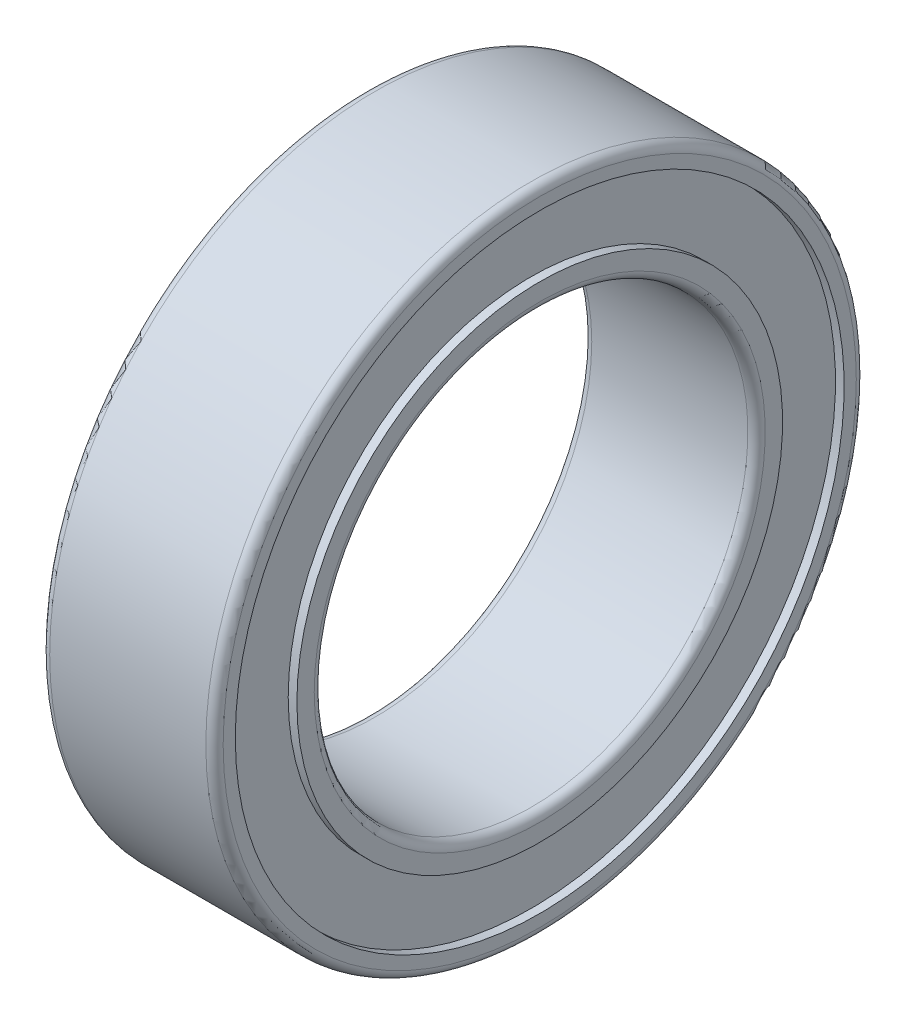
ISO-10303-21;
HEADER;
FILE_DESCRIPTION(('STEP AP214'),'2;1');
FILE_NAME('part.step','',(''),(''),'','','');
FILE_SCHEMA(('AUTOMOTIVE_DESIGN { 1 0 10303 214 1 1 1 1 }'));
ENDSEC;
DATA;
#1=APPLICATION_CONTEXT('core data for automotive mechanical design processes');
#2=APPLICATION_PROTOCOL_DEFINITION('international standard','automotive_design',2000,#1);
#3=PRODUCT_CONTEXT('',#1,'mechanical');
#4=PRODUCT('Part','Part','',(#3));
#5=PRODUCT_RELATED_PRODUCT_CATEGORY('part','',(#4));
#6=PRODUCT_DEFINITION_FORMATION('','',#4);
#7=PRODUCT_DEFINITION_CONTEXT('part definition',#1,'design');
#8=PRODUCT_DEFINITION('design','',#6,#7);
#9=PRODUCT_DEFINITION_SHAPE('','',#8);
#10=(LENGTH_UNIT() NAMED_UNIT(*) SI_UNIT(.MILLI.,.METRE.));
#11=(NAMED_UNIT(*) PLANE_ANGLE_UNIT() SI_UNIT($,.RADIAN.));
#12=(NAMED_UNIT(*) SI_UNIT($,.STERADIAN.) SOLID_ANGLE_UNIT());
#13=UNCERTAINTY_MEASURE_WITH_UNIT(LENGTH_MEASURE(1.E-05),#10,'distance_accuracy_value','');
#14=(GEOMETRIC_REPRESENTATION_CONTEXT(3) GLOBAL_UNCERTAINTY_ASSIGNED_CONTEXT((#13)) GLOBAL_UNIT_ASSIGNED_CONTEXT((#10,
#11,#12)) REPRESENTATION_CONTEXT('',''));
#15=CARTESIAN_POINT('',(0.,0.,0.));
#16=DIRECTION('',(0.,0.,1.));
#17=DIRECTION('',(1.,0.,0.));
#18=AXIS2_PLACEMENT_3D('',#15,#16,#17);
#19=CARTESIAN_POINT('',(0.,7.5,0.));
#20=DIRECTION('',(1.,0.,0.));
#21=DIRECTION('',(0.,0.,-1.));
#22=AXIS2_PLACEMENT_3D('',#19,#20,#21);
#23=PLANE('',#22);
#24=CARTESIAN_POINT('',(0.,0.,0.));
#25=DIRECTION('',(1.,0.,0.));
#26=DIRECTION('',(0.,0.,-1.));
#27=AXIS2_PLACEMENT_3D('',#24,#25,#26);
#28=CIRCLE('',#27,7.3);
#29=CARTESIAN_POINT('',(0.,0.,-7.3));
#30=VERTEX_POINT('',#29);
#31=EDGE_CURVE('E66',#30,#30,#28,.F.);
#32=ORIENTED_EDGE('',*,*,#31,.T.);
#33=EDGE_LOOP('',(#32));
#34=FACE_BOUND('',#33,.T.);
#35=CARTESIAN_POINT('',(0.,0.,0.));
#36=DIRECTION('',(-1.,0.,0.));
#37=DIRECTION('',(0.,0.,1.));
#38=AXIS2_PLACEMENT_3D('',#35,#36,#37);
#39=CIRCLE('',#38,7.02);
#40=CARTESIAN_POINT('',(0.,0.,7.02));
#41=VERTEX_POINT('',#40);
#42=EDGE_CURVE('E82',#41,#41,#39,.T.);
#43=ORIENTED_EDGE('',*,*,#42,.F.);
#44=EDGE_LOOP('',(#43));
#45=FACE_BOUND('',#44,.T.);
#46=ADVANCED_FACE('F40',(#34,#45),#23,.F.);
#47=CARTESIAN_POINT('',(0.,0.,0.));
#48=DIRECTION('',(-1.,0.,0.));
#49=DIRECTION('',(0.,0.,1.));
#50=AXIS2_PLACEMENT_3D('',#47,#48,#49);
#51=CYLINDRICAL_SURFACE('',#50,7.02);
#52=CARTESIAN_POINT('',(0.2,0.,0.));
#53=DIRECTION('',(-1.,0.,0.));
#54=DIRECTION('',(0.,0.,1.));
#55=AXIS2_PLACEMENT_3D('',#52,#53,#54);
#56=CIRCLE('',#55,7.02);
#57=CARTESIAN_POINT('',(0.2,0.,7.02));
#58=VERTEX_POINT('',#57);
#59=EDGE_CURVE('E86',#58,#58,#56,.T.);
#60=ORIENTED_EDGE('',*,*,#59,.F.);
#61=EDGE_LOOP('',(#60));
#62=FACE_BOUND('',#61,.T.);
#63=ORIENTED_EDGE('',*,*,#42,.T.);
#64=EDGE_LOOP('',(#63));
#65=FACE_BOUND('',#64,.T.);
#66=ADVANCED_FACE('F147',(#62,#65),#51,.F.);
#67=CARTESIAN_POINT('',(0.2,7.02,0.));
#68=DIRECTION('',(1.,0.,0.));
#69=DIRECTION('',(0.,0.,-1.));
#70=AXIS2_PLACEMENT_3D('',#67,#68,#69);
#71=PLANE('',#70);
#72=CARTESIAN_POINT('',(0.2,0.,0.));
#73=DIRECTION('',(-1.,0.,0.));
#74=DIRECTION('',(0.,0.,1.));
#75=AXIS2_PLACEMENT_3D('',#72,#73,#74);
#76=CIRCLE('',#75,5.6);
#77=CARTESIAN_POINT('',(0.2,0.,5.6));
#78=VERTEX_POINT('',#77);
#79=EDGE_CURVE('E90',#78,#78,#76,.T.);
#80=ORIENTED_EDGE('',*,*,#79,.F.);
#81=EDGE_LOOP('',(#80));
#82=FACE_BOUND('',#81,.T.);
#83=ORIENTED_EDGE('',*,*,#59,.T.);
#84=EDGE_LOOP('',(#83));
#85=FACE_BOUND('',#84,.T.);
#86=ADVANCED_FACE('F153',(#82,#85),#71,.F.);
#87=CARTESIAN_POINT('',(0.,0.,0.));
#88=DIRECTION('',(-1.,0.,0.));
#89=DIRECTION('',(0.,0.,1.));
#90=AXIS2_PLACEMENT_3D('',#87,#88,#89);
#91=CYLINDRICAL_SURFACE('',#90,5.6);
#92=CARTESIAN_POINT('',(0.,0.,0.));
#93=DIRECTION('',(-1.,0.,0.));
#94=DIRECTION('',(0.,0.,1.));
#95=AXIS2_PLACEMENT_3D('',#92,#93,#94);
#96=CIRCLE('',#95,5.6);
#97=CARTESIAN_POINT('',(0.,0.,5.6));
#98=VERTEX_POINT('',#97);
#99=EDGE_CURVE('E94',#98,#98,#96,.T.);
#100=ORIENTED_EDGE('',*,*,#99,.F.);
#101=EDGE_LOOP('',(#100));
#102=FACE_BOUND('',#101,.T.);
#103=ORIENTED_EDGE('',*,*,#79,.T.);
#104=EDGE_LOOP('',(#103));
#105=FACE_BOUND('',#104,.T.);
#106=ADVANCED_FACE('F254',(#102,#105),#91,.T.);
#107=CARTESIAN_POINT('',(0.,5.6,0.));
#108=DIRECTION('',(1.,0.,0.));
#109=DIRECTION('',(0.,0.,-1.));
#110=AXIS2_PLACEMENT_3D('',#107,#108,#109);
#111=PLANE('',#110);
#112=CARTESIAN_POINT('',(0.,0.,0.));
#113=DIRECTION('',(1.,0.,0.));
#114=DIRECTION('',(0.,0.,-1.));
#115=AXIS2_PLACEMENT_3D('',#112,#113,#114);
#116=CIRCLE('',#115,5.2);
#117=CARTESIAN_POINT('',(0.,0.,-5.2));
#118=VERTEX_POINT('',#117);
#119=EDGE_CURVE('E10',#118,#118,#116,.T.);
#120=ORIENTED_EDGE('',*,*,#119,.T.);
#121=EDGE_LOOP('',(#120));
#122=FACE_BOUND('',#121,.T.);
#123=ORIENTED_EDGE('',*,*,#99,.T.);
#124=EDGE_LOOP('',(#123));
#125=FACE_BOUND('',#124,.T.);
#126=ADVANCED_FACE('F144',(#122,#125),#111,.F.);
#127=CARTESIAN_POINT('',(0.,0.,0.));
#128=DIRECTION('',(-1.,0.,0.));
#129=DIRECTION('',(0.,0.,1.));
#130=AXIS2_PLACEMENT_3D('',#127,#128,#129);
#131=CYLINDRICAL_SURFACE('',#130,5.);
#132=CARTESIAN_POINT('',(3.80000000000001,0.,0.));
#133=DIRECTION('',(-1.,0.,0.));
#134=DIRECTION('',(0.,0.,1.));
#135=AXIS2_PLACEMENT_3D('',#132,#133,#134);
#136=CIRCLE('',#135,5.);
#137=CARTESIAN_POINT('',(3.80000000000001,0.,5.));
#138=VERTEX_POINT('',#137);
#139=EDGE_CURVE('E48',#138,#138,#136,.F.);
#140=ORIENTED_EDGE('',*,*,#139,.T.);
#141=EDGE_LOOP('',(#140));
#142=FACE_BOUND('',#141,.T.);
#143=CARTESIAN_POINT('',(0.200000000000006,0.,0.));
#144=DIRECTION('',(1.,0.,0.));
#145=DIRECTION('',(0.,0.,-1.));
#146=AXIS2_PLACEMENT_3D('',#143,#144,#145);
#147=CIRCLE('',#146,5.);
#148=CARTESIAN_POINT('',(0.200000000000006,0.,-5.));
#149=VERTEX_POINT('',#148);
#150=EDGE_CURVE('E54',#149,#149,#147,.F.);
#151=ORIENTED_EDGE('',*,*,#150,.T.);
#152=EDGE_LOOP('',(#151));
#153=FACE_BOUND('',#152,.T.);
#154=ADVANCED_FACE('F138',(#142,#153),#131,.F.);
#155=CARTESIAN_POINT('',(4.00000000000001,5.60000000000001,0.));
#156=DIRECTION('',(-1.,0.,0.));
#157=DIRECTION('',(0.,0.,1.));
#158=AXIS2_PLACEMENT_3D('',#155,#156,#157);
#159=PLANE('',#158);
#160=CARTESIAN_POINT('',(4.00000000000001,0.,0.));
#161=DIRECTION('',(-1.,0.,0.));
#162=DIRECTION('',(0.,0.,1.));
#163=AXIS2_PLACEMENT_3D('',#160,#161,#162);
#164=CIRCLE('',#163,5.2);
#165=CARTESIAN_POINT('',(4.00000000000001,0.,5.2));
#166=VERTEX_POINT('',#165);
#167=EDGE_CURVE('E60',#166,#166,#164,.T.);
#168=ORIENTED_EDGE('',*,*,#167,.T.);
#169=EDGE_LOOP('',(#168));
#170=FACE_BOUND('',#169,.T.);
#171=CARTESIAN_POINT('',(4.00000000000001,0.,0.));
#172=DIRECTION('',(-1.,0.,0.));
#173=DIRECTION('',(0.,0.,1.));
#174=AXIS2_PLACEMENT_3D('',#171,#172,#173);
#175=CIRCLE('',#174,5.60000000000001);
#176=CARTESIAN_POINT('',(4.00000000000001,0.,5.60000000000001));
#177=VERTEX_POINT('',#176);
#178=EDGE_CURVE('E98',#177,#177,#175,.T.);
#179=ORIENTED_EDGE('',*,*,#178,.F.);
#180=EDGE_LOOP('',(#179));
#181=FACE_BOUND('',#180,.T.);
#182=ADVANCED_FACE('F133',(#170,#181),#159,.F.);
#183=CARTESIAN_POINT('',(0.,0.,0.));
#184=DIRECTION('',(-1.,0.,0.));
#185=DIRECTION('',(0.,0.,1.));
#186=AXIS2_PLACEMENT_3D('',#183,#184,#185);
#187=CYLINDRICAL_SURFACE('',#186,5.6);
#188=CARTESIAN_POINT('',(3.8,0.,0.));
#189=DIRECTION('',(-1.,0.,0.));
#190=DIRECTION('',(0.,0.,1.));
#191=AXIS2_PLACEMENT_3D('',#188,#189,#190);
#192=CIRCLE('',#191,5.6);
#193=CARTESIAN_POINT('',(3.8,0.,5.6));
#194=VERTEX_POINT('',#193);
#195=EDGE_CURVE('E102',#194,#194,#192,.T.);
#196=ORIENTED_EDGE('',*,*,#195,.F.);
#197=EDGE_LOOP('',(#196));
#198=FACE_BOUND('',#197,.T.);
#199=ORIENTED_EDGE('',*,*,#178,.T.);
#200=EDGE_LOOP('',(#199));
#201=FACE_BOUND('',#200,.T.);
#202=ADVANCED_FACE('F127',(#198,#201),#187,.T.);
#203=CARTESIAN_POINT('',(3.8,7.02,0.));
#204=DIRECTION('',(-1.,0.,0.));
#205=DIRECTION('',(0.,0.,1.));
#206=AXIS2_PLACEMENT_3D('',#203,#204,#205);
#207=PLANE('',#206);
#208=CARTESIAN_POINT('',(3.8,0.,0.));
#209=DIRECTION('',(-1.,0.,0.));
#210=DIRECTION('',(0.,0.,1.));
#211=AXIS2_PLACEMENT_3D('',#208,#209,#210);
#212=CIRCLE('',#211,7.02);
#213=CARTESIAN_POINT('',(3.8,0.,7.02));
#214=VERTEX_POINT('',#213);
#215=EDGE_CURVE('E106',#214,#214,#212,.T.);
#216=ORIENTED_EDGE('',*,*,#215,.F.);
#217=EDGE_LOOP('',(#216));
#218=FACE_BOUND('',#217,.T.);
#219=ORIENTED_EDGE('',*,*,#195,.T.);
#220=EDGE_LOOP('',(#219));
#221=FACE_BOUND('',#220,.T.);
#222=ADVANCED_FACE('F121',(#218,#221),#207,.F.);
#223=CARTESIAN_POINT('',(0.,0.,0.));
#224=DIRECTION('',(-1.,0.,0.));
#225=DIRECTION('',(0.,0.,1.));
#226=AXIS2_PLACEMENT_3D('',#223,#224,#225);
#227=CYLINDRICAL_SURFACE('',#226,7.02);
#228=CARTESIAN_POINT('',(4.00000000000001,0.,0.));
#229=DIRECTION('',(-1.,0.,0.));
#230=DIRECTION('',(0.,0.,1.));
#231=AXIS2_PLACEMENT_3D('',#228,#229,#230);
#232=CIRCLE('',#231,7.02);
#233=CARTESIAN_POINT('',(4.00000000000001,0.,7.02));
#234=VERTEX_POINT('',#233);
#235=EDGE_CURVE('E110',#234,#234,#232,.T.);
#236=ORIENTED_EDGE('',*,*,#235,.F.);
#237=EDGE_LOOP('',(#236));
#238=FACE_BOUND('',#237,.T.);
#239=ORIENTED_EDGE('',*,*,#215,.T.);
#240=EDGE_LOOP('',(#239));
#241=FACE_BOUND('',#240,.T.);
#242=ADVANCED_FACE('F118',(#238,#241),#227,.F.);
#243=CARTESIAN_POINT('',(4.00000000000001,7.50000000000001,0.));
#244=DIRECTION('',(-1.,0.,0.));
#245=DIRECTION('',(0.,0.,1.));
#246=AXIS2_PLACEMENT_3D('',#243,#244,#245);
#247=PLANE('',#246);
#248=CARTESIAN_POINT('',(4.00000000000001,0.,0.));
#249=DIRECTION('',(-1.,0.,0.));
#250=DIRECTION('',(0.,0.,1.));
#251=AXIS2_PLACEMENT_3D('',#248,#249,#250);
#252=CIRCLE('',#251,7.3);
#253=CARTESIAN_POINT('',(4.00000000000001,0.,7.3));
#254=VERTEX_POINT('',#253);
#255=EDGE_CURVE('E70',#254,#254,#252,.F.);
#256=ORIENTED_EDGE('',*,*,#255,.T.);
#257=EDGE_LOOP('',(#256));
#258=FACE_BOUND('',#257,.T.);
#259=ORIENTED_EDGE('',*,*,#235,.T.);
#260=EDGE_LOOP('',(#259));
#261=FACE_BOUND('',#260,.T.);
#262=ADVANCED_FACE('F116',(#258,#261),#247,.F.);
#263=CARTESIAN_POINT('',(0.,0.,0.));
#264=DIRECTION('',(-1.,0.,0.));
#265=DIRECTION('',(0.,0.,1.));
#266=AXIS2_PLACEMENT_3D('',#263,#264,#265);
#267=CYLINDRICAL_SURFACE('',#266,7.5);
#268=CARTESIAN_POINT('',(3.80000000000001,0.,0.));
#269=DIRECTION('',(-1.,0.,0.));
#270=DIRECTION('',(0.,0.,1.));
#271=AXIS2_PLACEMENT_3D('',#268,#269,#270);
#272=CIRCLE('',#271,7.5);
#273=CARTESIAN_POINT('',(3.80000000000001,0.,7.5));
#274=VERTEX_POINT('',#273);
#275=EDGE_CURVE('E74',#274,#274,#272,.T.);
#276=ORIENTED_EDGE('',*,*,#275,.T.);
#277=EDGE_LOOP('',(#276));
#278=FACE_BOUND('',#277,.T.);
#279=CARTESIAN_POINT('',(0.200000000000006,0.,0.));
#280=DIRECTION('',(1.,0.,0.));
#281=DIRECTION('',(0.,0.,-1.));
#282=AXIS2_PLACEMENT_3D('',#279,#280,#281);
#283=CIRCLE('',#282,7.5);
#284=CARTESIAN_POINT('',(0.200000000000006,0.,-7.5));
#285=VERTEX_POINT('',#284);
#286=EDGE_CURVE('E78',#285,#285,#283,.T.);
#287=ORIENTED_EDGE('',*,*,#286,.T.);
#288=EDGE_LOOP('',(#287));
#289=FACE_BOUND('',#288,.T.);
#290=ADVANCED_FACE('F163',(#278,#289),#267,.T.);
#291=CARTESIAN_POINT('',(3.80000000000001,0.,0.));
#292=DIRECTION('',(-1.,0.,0.));
#293=DIRECTION('',(0.,0.,1.));
#294=AXIS2_PLACEMENT_3D('',#291,#292,#293);
#295=TOROIDAL_SURFACE('',#294,7.3,0.2);
#296=ORIENTED_EDGE('',*,*,#255,.F.);
#297=EDGE_LOOP('',(#296));
#298=FACE_BOUND('',#297,.T.);
#299=ORIENTED_EDGE('',*,*,#275,.F.);
#300=EDGE_LOOP('',(#299));
#301=FACE_BOUND('',#300,.T.);
#302=ADVANCED_FACE('F159',(#298,#301),#295,.T.);
#303=CARTESIAN_POINT('',(0.200000000000006,0.,0.));
#304=DIRECTION('',(1.,0.,0.));
#305=DIRECTION('',(0.,0.,-1.));
#306=AXIS2_PLACEMENT_3D('',#303,#304,#305);
#307=TOROIDAL_SURFACE('',#306,7.3,0.2);
#308=ORIENTED_EDGE('',*,*,#286,.F.);
#309=EDGE_LOOP('',(#308));
#310=FACE_BOUND('',#309,.T.);
#311=ORIENTED_EDGE('',*,*,#31,.F.);
#312=EDGE_LOOP('',(#311));
#313=FACE_BOUND('',#312,.T.);
#314=ADVANCED_FACE('F162',(#310,#313),#307,.T.);
#315=CARTESIAN_POINT('',(3.80000000000001,0.,0.));
#316=DIRECTION('',(-1.,0.,0.));
#317=DIRECTION('',(0.,0.,1.));
#318=AXIS2_PLACEMENT_3D('',#315,#316,#317);
#319=TOROIDAL_SURFACE('',#318,5.2,0.2);
#320=ORIENTED_EDGE('',*,*,#139,.F.);
#321=EDGE_LOOP('',(#320));
#322=FACE_BOUND('',#321,.T.);
#323=ORIENTED_EDGE('',*,*,#167,.F.);
#324=EDGE_LOOP('',(#323));
#325=FACE_BOUND('',#324,.T.);
#326=ADVANCED_FACE('F166',(#322,#325),#319,.T.);
#327=CARTESIAN_POINT('',(0.200000000000006,0.,0.));
#328=DIRECTION('',(1.,0.,0.));
#329=DIRECTION('',(0.,0.,-1.));
#330=AXIS2_PLACEMENT_3D('',#327,#328,#329);
#331=TOROIDAL_SURFACE('',#330,5.2,0.2);
#332=ORIENTED_EDGE('',*,*,#119,.F.);
#333=EDGE_LOOP('',(#332));
#334=FACE_BOUND('',#333,.T.);
#335=ORIENTED_EDGE('',*,*,#150,.F.);
#336=EDGE_LOOP('',(#335));
#337=FACE_BOUND('',#336,.T.);
#338=ADVANCED_FACE('F42',(#334,#337),#331,.T.);
#339=CLOSED_SHELL('',(#46,#66,#86,#106,#126,#154,#182,#202,#222,#242,#262,#290,#302,#314,#326,#338));
#340=MANIFOLD_SOLID_BREP('B2',#339);
#341=ADVANCED_BREP_SHAPE_REPRESENTATION('',(#18,#340),#14);
#342=SHAPE_DEFINITION_REPRESENTATION(#9,#341);
ENDSEC;
END-ISO-10303-21;
